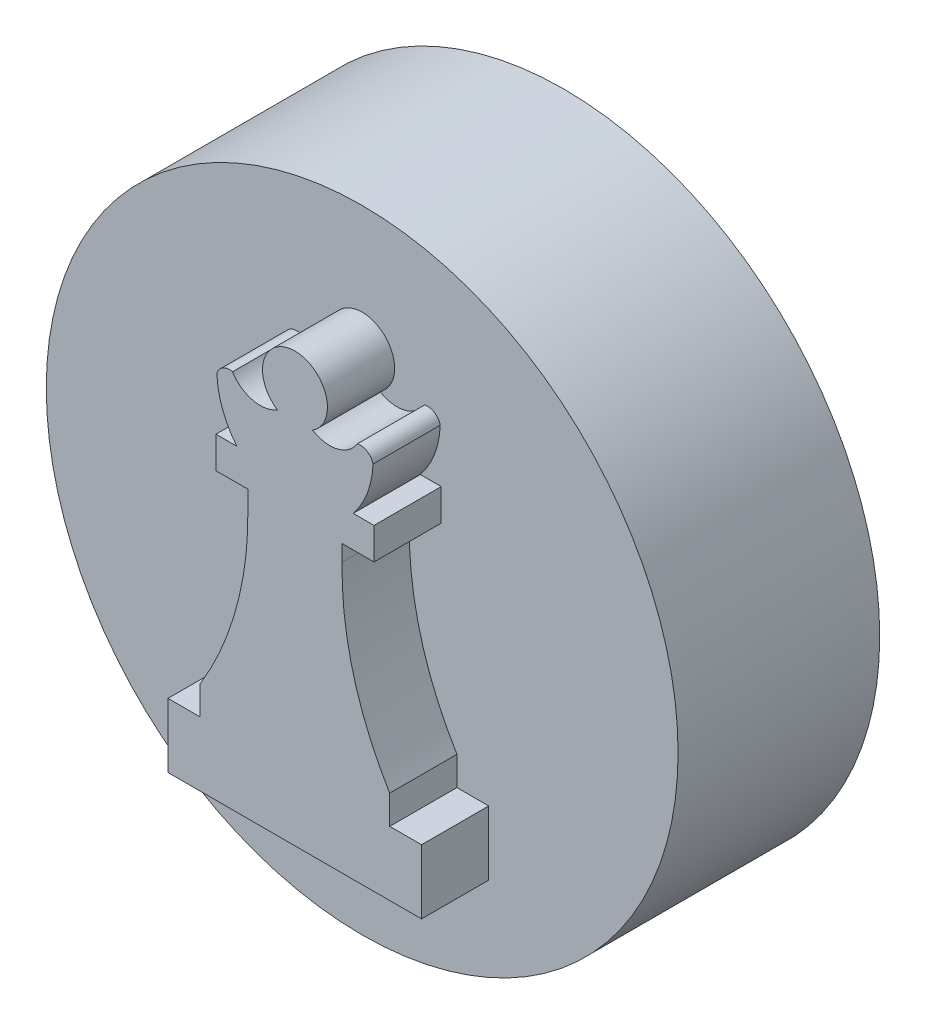
ISO-10303-21;
HEADER;
FILE_DESCRIPTION(('STEP AP214'),'2;1');
FILE_NAME('part.step','',(''),(''),'','','');
FILE_SCHEMA(('AUTOMOTIVE_DESIGN { 1 0 10303 214 1 1 1 1 }'));
ENDSEC;
DATA;
#1=APPLICATION_CONTEXT('core data for automotive mechanical design processes');
#2=APPLICATION_PROTOCOL_DEFINITION('international standard','automotive_design',2000,#1);
#3=PRODUCT_CONTEXT('',#1,'mechanical');
#4=PRODUCT('Part','Part','',(#3));
#5=PRODUCT_RELATED_PRODUCT_CATEGORY('part','',(#4));
#6=PRODUCT_DEFINITION_FORMATION('','',#4);
#7=PRODUCT_DEFINITION_CONTEXT('part definition',#1,'design');
#8=PRODUCT_DEFINITION('design','',#6,#7);
#9=PRODUCT_DEFINITION_SHAPE('','',#8);
#10=(LENGTH_UNIT() NAMED_UNIT(*) SI_UNIT(.MILLI.,.METRE.));
#11=(NAMED_UNIT(*) PLANE_ANGLE_UNIT() SI_UNIT($,.RADIAN.));
#12=(NAMED_UNIT(*) SI_UNIT($,.STERADIAN.) SOLID_ANGLE_UNIT());
#13=UNCERTAINTY_MEASURE_WITH_UNIT(LENGTH_MEASURE(1.E-05),#10,'distance_accuracy_value','');
#14=(GEOMETRIC_REPRESENTATION_CONTEXT(3) GLOBAL_UNCERTAINTY_ASSIGNED_CONTEXT((#13)) GLOBAL_UNIT_ASSIGNED_CONTEXT((#10,
#11,#12)) REPRESENTATION_CONTEXT('',''));
#15=CARTESIAN_POINT('',(0.,0.,0.));
#16=DIRECTION('',(0.,0.,1.));
#17=DIRECTION('',(1.,0.,0.));
#18=AXIS2_PLACEMENT_3D('',#15,#16,#17);
#19=CARTESIAN_POINT('',(0.,0.,0.));
#20=DIRECTION('',(0.,0.,1.));
#21=DIRECTION('',(1.,0.,0.));
#22=AXIS2_PLACEMENT_3D('',#19,#20,#21);
#23=PLANE('',#22);
#24=CARTESIAN_POINT('',(0.,0.,0.));
#25=DIRECTION('',(0.,0.,1.));
#26=DIRECTION('',(1.,0.,0.));
#27=AXIS2_PLACEMENT_3D('',#24,#25,#26);
#28=CIRCLE('',#27,11.938);
#29=CARTESIAN_POINT('',(11.938,0.,0.));
#30=VERTEX_POINT('',#29);
#31=EDGE_CURVE('E11',#30,#30,#28,.T.);
#32=ORIENTED_EDGE('',*,*,#31,.F.);
#33=EDGE_LOOP('',(#32));
#34=FACE_BOUND('',#33,.T.);
#35=CARTESIAN_POINT('',(0.,0.,0.));
#36=DIRECTION('',(0.,0.,1.));
#37=DIRECTION('',(1.,0.,0.));
#38=AXIS2_PLACEMENT_3D('',#35,#36,#37);
#39=CIRCLE('',#38,8.763);
#40=CARTESIAN_POINT('',(8.763,0.,0.));
#41=VERTEX_POINT('',#40);
#42=EDGE_CURVE('E52',#41,#41,#39,.T.);
#43=ORIENTED_EDGE('',*,*,#42,.T.);
#44=EDGE_LOOP('',(#43));
#45=FACE_BOUND('',#44,.T.);
#46=ADVANCED_FACE('F43',(#34,#45),#23,.F.);
#47=CARTESIAN_POINT('',(0.,0.,5.08));
#48=DIRECTION('',(0.,0.,-1.));
#49=DIRECTION('',(-1.,0.,0.));
#50=AXIS2_PLACEMENT_3D('',#47,#48,#49);
#51=CYLINDRICAL_SURFACE('',#50,11.938);
#52=ORIENTED_EDGE('',*,*,#31,.T.);
#53=EDGE_LOOP('',(#52));
#54=FACE_BOUND('',#53,.T.);
#55=CARTESIAN_POINT('',(0.,0.,7.62));
#56=DIRECTION('',(0.,0.,1.));
#57=DIRECTION('',(1.,0.,0.));
#58=AXIS2_PLACEMENT_3D('',#55,#56,#57);
#59=CIRCLE('',#58,11.938);
#60=CARTESIAN_POINT('',(11.938,0.,7.62));
#61=VERTEX_POINT('',#60);
#62=EDGE_CURVE('E245',#61,#61,#59,.T.);
#63=ORIENTED_EDGE('',*,*,#62,.F.);
#64=EDGE_LOOP('',(#63));
#65=FACE_BOUND('',#64,.T.);
#66=ADVANCED_FACE('F45',(#54,#65),#51,.T.);
#67=CARTESIAN_POINT('',(0.,0.,5.08));
#68=DIRECTION('',(0.,0.,-1.));
#69=DIRECTION('',(-1.,0.,0.));
#70=AXIS2_PLACEMENT_3D('',#67,#68,#69);
#71=CYLINDRICAL_SURFACE('',#70,8.763);
#72=CARTESIAN_POINT('',(0.,0.,5.08));
#73=DIRECTION('',(0.,0.,1.));
#74=DIRECTION('',(1.,0.,0.));
#75=AXIS2_PLACEMENT_3D('',#72,#73,#74);
#76=CIRCLE('',#75,8.763);
#77=CARTESIAN_POINT('',(8.763,0.,5.08));
#78=VERTEX_POINT('',#77);
#79=EDGE_CURVE('E250',#78,#78,#76,.T.);
#80=ORIENTED_EDGE('',*,*,#79,.T.);
#81=EDGE_LOOP('',(#80));
#82=FACE_BOUND('',#81,.T.);
#83=ORIENTED_EDGE('',*,*,#42,.F.);
#84=EDGE_LOOP('',(#83));
#85=FACE_BOUND('',#84,.T.);
#86=ADVANCED_FACE('F263',(#82,#85),#71,.F.);
#87=CARTESIAN_POINT('',(0.,0.,5.08));
#88=DIRECTION('',(0.,0.,1.));
#89=DIRECTION('',(1.,0.,0.));
#90=AXIS2_PLACEMENT_3D('',#87,#88,#89);
#91=PLANE('',#90);
#92=ORIENTED_EDGE('',*,*,#79,.F.);
#93=EDGE_LOOP('',(#92));
#94=FACE_BOUND('',#93,.T.);
#95=ADVANCED_FACE('F265',(#94),#91,.F.);
#96=CARTESIAN_POINT('',(0.,0.,7.62));
#97=DIRECTION('',(0.,0.,1.));
#98=DIRECTION('',(1.,0.,0.));
#99=AXIS2_PLACEMENT_3D('',#96,#97,#98);
#100=PLANE('',#99);
#101=CARTESIAN_POINT('',(14.1178732428506,2.18790034546617,7.62));
#102=DIRECTION('',(0.,0.,-1.));
#103=DIRECTION('',(-1.,0.,0.));
#104=AXIS2_PLACEMENT_3D('',#101,#102,#103);
#105=CIRCLE('',#104,12.3397850795467);
#106=CARTESIAN_POINT('',(3.5812032049433,-4.23462877643526,7.62));
#107=VERTEX_POINT('',#106);
#108=CARTESIAN_POINT('',(1.78033276673354,2.42325286739607,7.62));
#109=VERTEX_POINT('',#108);
#110=EDGE_CURVE('E61',#107,#109,#105,.T.);
#111=ORIENTED_EDGE('',*,*,#110,.F.);
#112=DIRECTION('',(0.,1.,0.));
#113=VECTOR('',#112,1.);
#114=CARTESIAN_POINT('',(3.5812032049433,-5.32306621584942,7.62));
#115=LINE('',#114,#113);
#116=CARTESIAN_POINT('',(3.5812032049433,-5.32306621584942,7.62));
#117=VERTEX_POINT('',#116);
#118=EDGE_CURVE('E65',#117,#107,#115,.T.);
#119=ORIENTED_EDGE('',*,*,#118,.F.);
#120=DIRECTION('',(1.,0.,0.));
#121=VECTOR('',#120,1.);
#122=CARTESIAN_POINT('',(3.5812032049433,-5.32306621584942,7.62));
#123=LINE('',#122,#121);
#124=CARTESIAN_POINT('',(4.78289084444419,-5.32306621584942,7.62));
#125=VERTEX_POINT('',#124);
#126=EDGE_CURVE('E569',#117,#125,#123,.T.);
#127=ORIENTED_EDGE('',*,*,#126,.T.);
#128=DIRECTION('',(0.,1.,0.));
#129=VECTOR('',#128,1.);
#130=CARTESIAN_POINT('',(4.78289084444419,-7.75058761291091,7.62));
#131=LINE('',#130,#129);
#132=CARTESIAN_POINT('',(4.78289084444419,-7.75058761291091,7.62));
#133=VERTEX_POINT('',#132);
#134=EDGE_CURVE('E732',#133,#125,#131,.T.);
#135=ORIENTED_EDGE('',*,*,#134,.F.);
#136=DIRECTION('',(1.,0.,0.));
#137=VECTOR('',#136,1.);
#138=CARTESIAN_POINT('',(-4.79891109273756,-7.75058761291091,7.62));
#139=LINE('',#138,#137);
#140=CARTESIAN_POINT('',(-4.79891109273756,-7.75058761291091,7.62));
#141=VERTEX_POINT('',#140);
#142=EDGE_CURVE('E728',#141,#133,#139,.T.);
#143=ORIENTED_EDGE('',*,*,#142,.F.);
#144=DIRECTION('',(0.,1.,0.));
#145=VECTOR('',#144,1.);
#146=CARTESIAN_POINT('',(-4.79891109273756,-7.75058761291091,7.62));
#147=LINE('',#146,#145);
#148=CARTESIAN_POINT('',(-4.79891109273756,-5.32306621584942,7.62));
#149=VERTEX_POINT('',#148);
#150=EDGE_CURVE('E725',#141,#149,#147,.T.);
#151=ORIENTED_EDGE('',*,*,#150,.T.);
#152=DIRECTION('',(1.,0.,0.));
#153=VECTOR('',#152,1.);
#154=CARTESIAN_POINT('',(-4.79891109273756,-5.32306621584942,7.62));
#155=LINE('',#154,#153);
#156=CARTESIAN_POINT('',(-3.5812032049433,-5.32306621584942,7.62));
#157=VERTEX_POINT('',#156);
#158=EDGE_CURVE('E722',#149,#157,#155,.T.);
#159=ORIENTED_EDGE('',*,*,#158,.T.);
#160=DIRECTION('',(0.,1.,0.));
#161=VECTOR('',#160,1.);
#162=CARTESIAN_POINT('',(-3.5812032049433,-5.32306621584942,7.62));
#163=LINE('',#162,#161);
#164=CARTESIAN_POINT('',(-3.58120320494331,-4.23462877643527,7.62));
#165=VERTEX_POINT('',#164);
#166=EDGE_CURVE('E719',#157,#165,#163,.T.);
#167=ORIENTED_EDGE('',*,*,#166,.T.);
#168=CARTESIAN_POINT('',(-14.1178732428506,2.18790034546617,7.62));
#169=DIRECTION('',(0.,0.,1.));
#170=DIRECTION('',(1.,0.,0.));
#171=AXIS2_PLACEMENT_3D('',#168,#169,#170);
#172=CIRCLE('',#171,12.3397850795467);
#173=CARTESIAN_POINT('',(-1.78033276673354,2.42325286739607,7.62));
#174=VERTEX_POINT('',#173);
#175=EDGE_CURVE('E716',#165,#174,#172,.T.);
#176=ORIENTED_EDGE('',*,*,#175,.T.);
#177=DIRECTION('',(0.,1.,0.));
#178=VECTOR('',#177,1.);
#179=CARTESIAN_POINT('',(-1.78033276673354,2.42325286739607,7.62));
#180=LINE('',#179,#178);
#181=CARTESIAN_POINT('',(-1.78033276673354,3.03304504856313,7.62));
#182=VERTEX_POINT('',#181);
#183=EDGE_CURVE('E713',#174,#182,#180,.T.);
#184=ORIENTED_EDGE('',*,*,#183,.T.);
#185=DIRECTION('',(1.,0.,0.));
#186=VECTOR('',#185,1.);
#187=CARTESIAN_POINT('',(-2.9866231897838,3.03304504856313,7.62));
#188=LINE('',#187,#186);
#189=CARTESIAN_POINT('',(-2.9866231897838,3.03304504856313,7.62));
#190=VERTEX_POINT('',#189);
#191=EDGE_CURVE('E709',#190,#182,#188,.T.);
#192=ORIENTED_EDGE('',*,*,#191,.F.);
#193=DIRECTION('',(0.,-1.,0.));
#194=VECTOR('',#193,1.);
#195=CARTESIAN_POINT('',(-2.9866231897838,4.22988557605376,7.62));
#196=LINE('',#195,#194);
#197=CARTESIAN_POINT('',(-2.9866231897838,4.22988557605376,7.62));
#198=VERTEX_POINT('',#197);
#199=EDGE_CURVE('E705',#198,#190,#196,.T.);
#200=ORIENTED_EDGE('',*,*,#199,.F.);
#201=DIRECTION('',(-1.,0.,0.));
#202=VECTOR('',#201,1.);
#203=CARTESIAN_POINT('',(-2.20008918199819,4.22988557605376,7.62));
#204=LINE('',#203,#202);
#205=CARTESIAN_POINT('',(-2.20008918199819,4.22988557605376,7.62));
#206=VERTEX_POINT('',#205);
#207=EDGE_CURVE('E701',#206,#198,#204,.T.);
#208=ORIENTED_EDGE('',*,*,#207,.F.);
#209=CARTESIAN_POINT('',(0.415223482436921,6.35186901560625,7.62));
#210=DIRECTION('',(0.,0.,-1.));
#211=DIRECTION('',(-1.,0.,0.));
#212=AXIS2_PLACEMENT_3D('',#209,#210,#211);
#213=CIRCLE('',#212,3.36788866361252);
#214=CARTESIAN_POINT('',(-2.95009700568467,6.22036972770418,7.62));
#215=VERTEX_POINT('',#214);
#216=EDGE_CURVE('E698',#206,#215,#213,.T.);
#217=ORIENTED_EDGE('',*,*,#216,.T.);
#218=CARTESIAN_POINT('',(-2.47138184616778,6.10745679508121,7.62));
#219=DIRECTION('',(0.,0.,1.));
#220=DIRECTION('',(1.,0.,0.));
#221=AXIS2_PLACEMENT_3D('',#218,#219,#220);
#222=CIRCLE('',#221,0.491851130226217);
#223=CARTESIAN_POINT('',(-2.35846891354481,6.5861719545981,7.62));
#224=VERTEX_POINT('',#223);
#225=EDGE_CURVE('E694',#224,#215,#222,.T.);
#226=ORIENTED_EDGE('',*,*,#225,.F.);
#227=CARTESIAN_POINT('',(-1.31363776866638,7.23218853934523,7.62));
#228=DIRECTION('',(0.,0.,-1.));
#229=DIRECTION('',(-1.,0.,0.));
#230=AXIS2_PLACEMENT_3D('',#227,#228,#229);
#231=CIRCLE('',#230,1.22841749787127);
#232=CARTESIAN_POINT('',(-0.667621183919253,6.18735739446679,7.62));
#233=VERTEX_POINT('',#232);
#234=EDGE_CURVE('E690',#233,#224,#231,.T.);
#235=ORIENTED_EDGE('',*,*,#234,.F.);
#236=CARTESIAN_POINT('',(0.,7.21690647742095,7.62));
#237=DIRECTION('',(0.,0.,1.));
#238=DIRECTION('',(1.,0.,0.));
#239=AXIS2_PLACEMENT_3D('',#236,#237,#238);
#240=CIRCLE('',#239,1.22706534440081);
#241=CARTESIAN_POINT('',(0.667621183919252,6.18735739446679,7.62));
#242=VERTEX_POINT('',#241);
#243=EDGE_CURVE('E686',#242,#233,#240,.T.);
#244=ORIENTED_EDGE('',*,*,#243,.F.);
#245=CARTESIAN_POINT('',(1.31363776866638,7.23218853934523,7.62));
#246=DIRECTION('',(0.,0.,1.));
#247=DIRECTION('',(1.,0.,0.));
#248=AXIS2_PLACEMENT_3D('',#245,#246,#247);
#249=CIRCLE('',#248,1.22841749787127);
#250=CARTESIAN_POINT('',(2.35846891354481,6.5861719545981,7.62));
#251=VERTEX_POINT('',#250);
#252=EDGE_CURVE('E683',#242,#251,#249,.T.);
#253=ORIENTED_EDGE('',*,*,#252,.T.);
#254=CARTESIAN_POINT('',(2.47138184616778,6.10745679508121,7.62));
#255=DIRECTION('',(0.,0.,-1.));
#256=DIRECTION('',(-1.,0.,0.));
#257=AXIS2_PLACEMENT_3D('',#254,#255,#256);
#258=CIRCLE('',#257,0.491851130226217);
#259=CARTESIAN_POINT('',(2.95009700568467,6.22036972770418,7.62));
#260=VERTEX_POINT('',#259);
#261=EDGE_CURVE('E680',#251,#260,#258,.T.);
#262=ORIENTED_EDGE('',*,*,#261,.T.);
#263=CARTESIAN_POINT('',(-0.415223482436921,6.35186901560625,7.62));
#264=DIRECTION('',(0.,0.,1.));
#265=DIRECTION('',(1.,0.,0.));
#266=AXIS2_PLACEMENT_3D('',#263,#264,#265);
#267=CIRCLE('',#266,3.36788866361252);
#268=CARTESIAN_POINT('',(2.20008918199819,4.22988557605376,7.62));
#269=VERTEX_POINT('',#268);
#270=EDGE_CURVE('E676',#269,#260,#267,.T.);
#271=ORIENTED_EDGE('',*,*,#270,.F.);
#272=DIRECTION('',(1.,0.,0.));
#273=VECTOR('',#272,1.);
#274=CARTESIAN_POINT('',(2.20008918199819,4.22988557605376,7.62));
#275=LINE('',#274,#273);
#276=CARTESIAN_POINT('',(2.9866231897838,4.22988557605376,7.62));
#277=VERTEX_POINT('',#276);
#278=EDGE_CURVE('E669',#269,#277,#275,.T.);
#279=ORIENTED_EDGE('',*,*,#278,.T.);
#280=DIRECTION('',(0.,-1.,0.));
#281=VECTOR('',#280,1.);
#282=CARTESIAN_POINT('',(2.9866231897838,4.22988557605376,7.62));
#283=LINE('',#282,#281);
#284=CARTESIAN_POINT('',(2.9866231897838,3.03304504856313,7.62));
#285=VERTEX_POINT('',#284);
#286=EDGE_CURVE('E660',#277,#285,#283,.T.);
#287=ORIENTED_EDGE('',*,*,#286,.T.);
#288=DIRECTION('',(-1.,0.,0.));
#289=VECTOR('',#288,1.);
#290=CARTESIAN_POINT('',(2.9866231897838,3.03304504856313,7.62));
#291=LINE('',#290,#289);
#292=CARTESIAN_POINT('',(1.78033276673354,3.03304504856313,7.62));
#293=VERTEX_POINT('',#292);
#294=EDGE_CURVE('E663',#285,#293,#291,.T.);
#295=ORIENTED_EDGE('',*,*,#294,.T.);
#296=DIRECTION('',(0.,1.,0.));
#297=VECTOR('',#296,1.);
#298=CARTESIAN_POINT('',(1.78033276673354,2.42325286739607,7.62));
#299=LINE('',#298,#297);
#300=EDGE_CURVE('E665',#109,#293,#299,.T.);
#301=ORIENTED_EDGE('',*,*,#300,.F.);
#302=EDGE_LOOP('',(#111,#119,#127,#135,#143,#151,#159,#167,#176,#184,#192,#200,#208,#217,#226,
#235,#244,#253,#262,#271,#279,#287,#295,#301));
#303=FACE_BOUND('',#302,.T.);
#304=ORIENTED_EDGE('',*,*,#62,.T.);
#305=EDGE_LOOP('',(#304));
#306=FACE_BOUND('',#305,.T.);
#307=ADVANCED_FACE('F272',(#303,#306),#100,.T.);
#308=CARTESIAN_POINT('',(14.1178732428506,2.18790034546617,10.16));
#309=DIRECTION('',(0.,0.,-1.));
#310=DIRECTION('',(-1.,0.,0.));
#311=AXIS2_PLACEMENT_3D('',#308,#309,#310);
#312=CYLINDRICAL_SURFACE('',#311,12.3397850795467);
#313=ORIENTED_EDGE('',*,*,#110,.T.);
#314=DIRECTION('',(0.,0.,-1.));
#315=VECTOR('',#314,1.);
#316=CARTESIAN_POINT('',(1.78033276673354,2.42325286739607,10.16));
#317=LINE('',#316,#315);
#318=CARTESIAN_POINT('',(1.78033276673354,2.42325286739607,10.16));
#319=VERTEX_POINT('',#318);
#320=EDGE_CURVE('E223',#319,#109,#317,.T.);
#321=ORIENTED_EDGE('',*,*,#320,.F.);
#322=CARTESIAN_POINT('',(14.1178732428506,2.18790034546617,10.16));
#323=DIRECTION('',(0.,0.,-1.));
#324=DIRECTION('',(-1.,0.,0.));
#325=AXIS2_PLACEMENT_3D('',#322,#323,#324);
#326=CIRCLE('',#325,12.3397850795467);
#327=CARTESIAN_POINT('',(3.5812032049433,-4.23462877643526,10.16));
#328=VERTEX_POINT('',#327);
#329=EDGE_CURVE('E231',#328,#319,#326,.T.);
#330=ORIENTED_EDGE('',*,*,#329,.F.);
#331=DIRECTION('',(0.,0.,-1.));
#332=VECTOR('',#331,1.);
#333=CARTESIAN_POINT('',(3.5812032049433,-4.23462877643526,10.16));
#334=LINE('',#333,#332);
#335=EDGE_CURVE('E565',#328,#107,#334,.T.);
#336=ORIENTED_EDGE('',*,*,#335,.T.);
#337=EDGE_LOOP('',(#313,#321,#330,#336));
#338=FACE_BOUND('',#337,.T.);
#339=ADVANCED_FACE('F243',(#338),#312,.F.);
#340=CARTESIAN_POINT('',(1.78033276673354,2.42325286739607,10.16));
#341=DIRECTION('',(-1.,0.,0.));
#342=DIRECTION('',(0.,0.,1.));
#343=AXIS2_PLACEMENT_3D('',#340,#341,#342);
#344=PLANE('',#343);
#345=ORIENTED_EDGE('',*,*,#300,.T.);
#346=DIRECTION('',(0.,0.,-1.));
#347=VECTOR('',#346,1.);
#348=CARTESIAN_POINT('',(1.78033276673354,3.03304504856313,10.16));
#349=LINE('',#348,#347);
#350=CARTESIAN_POINT('',(1.78033276673354,3.03304504856313,10.16));
#351=VERTEX_POINT('',#350);
#352=EDGE_CURVE('E225',#351,#293,#349,.T.);
#353=ORIENTED_EDGE('',*,*,#352,.F.);
#354=DIRECTION('',(0.,1.,0.));
#355=VECTOR('',#354,1.);
#356=CARTESIAN_POINT('',(1.78033276673354,2.42325286739607,10.16));
#357=LINE('',#356,#355);
#358=EDGE_CURVE('E218',#319,#351,#357,.T.);
#359=ORIENTED_EDGE('',*,*,#358,.F.);
#360=ORIENTED_EDGE('',*,*,#320,.T.);
#361=EDGE_LOOP('',(#345,#353,#359,#360));
#362=FACE_BOUND('',#361,.T.);
#363=ADVANCED_FACE('F221',(#362),#344,.F.);
#364=CARTESIAN_POINT('',(2.9866231897838,3.03304504856313,10.16));
#365=DIRECTION('',(0.,-1.,0.));
#366=DIRECTION('',(0.,0.,-1.));
#367=AXIS2_PLACEMENT_3D('',#364,#365,#366);
#368=PLANE('',#367);
#369=ORIENTED_EDGE('',*,*,#294,.F.);
#370=DIRECTION('',(0.,0.,-1.));
#371=VECTOR('',#370,1.);
#372=CARTESIAN_POINT('',(2.9866231897838,3.03304504856313,10.16));
#373=LINE('',#372,#371);
#374=CARTESIAN_POINT('',(2.9866231897838,3.03304504856313,10.16));
#375=VERTEX_POINT('',#374);
#376=EDGE_CURVE('E252',#375,#285,#373,.T.);
#377=ORIENTED_EDGE('',*,*,#376,.F.);
#378=DIRECTION('',(-1.,0.,0.));
#379=VECTOR('',#378,1.);
#380=CARTESIAN_POINT('',(2.9866231897838,3.03304504856313,10.16));
#381=LINE('',#380,#379);
#382=EDGE_CURVE('E230',#375,#351,#381,.T.);
#383=ORIENTED_EDGE('',*,*,#382,.T.);
#384=ORIENTED_EDGE('',*,*,#352,.T.);
#385=EDGE_LOOP('',(#369,#377,#383,#384));
#386=FACE_BOUND('',#385,.T.);
#387=ADVANCED_FACE('F293',(#386),#368,.T.);
#388=CARTESIAN_POINT('',(2.9866231897838,4.22988557605376,10.16));
#389=DIRECTION('',(1.,0.,0.));
#390=DIRECTION('',(0.,0.,-1.));
#391=AXIS2_PLACEMENT_3D('',#388,#389,#390);
#392=PLANE('',#391);
#393=ORIENTED_EDGE('',*,*,#286,.F.);
#394=DIRECTION('',(0.,0.,-1.));
#395=VECTOR('',#394,1.);
#396=CARTESIAN_POINT('',(2.9866231897838,4.22988557605376,10.16));
#397=LINE('',#396,#395);
#398=CARTESIAN_POINT('',(2.9866231897838,4.22988557605376,10.16));
#399=VERTEX_POINT('',#398);
#400=EDGE_CURVE('E652',#399,#277,#397,.T.);
#401=ORIENTED_EDGE('',*,*,#400,.F.);
#402=DIRECTION('',(0.,-1.,0.));
#403=VECTOR('',#402,1.);
#404=CARTESIAN_POINT('',(2.9866231897838,4.22988557605376,10.16));
#405=LINE('',#404,#403);
#406=EDGE_CURVE('E662',#399,#375,#405,.T.);
#407=ORIENTED_EDGE('',*,*,#406,.T.);
#408=ORIENTED_EDGE('',*,*,#376,.T.);
#409=EDGE_LOOP('',(#393,#401,#407,#408));
#410=FACE_BOUND('',#409,.T.);
#411=ADVANCED_FACE('F296',(#410),#392,.T.);
#412=CARTESIAN_POINT('',(2.20008918199819,4.22988557605376,10.16));
#413=DIRECTION('',(0.,1.,0.));
#414=DIRECTION('',(0.,0.,1.));
#415=AXIS2_PLACEMENT_3D('',#412,#413,#414);
#416=PLANE('',#415);
#417=ORIENTED_EDGE('',*,*,#278,.F.);
#418=DIRECTION('',(0.,0.,-1.));
#419=VECTOR('',#418,1.);
#420=CARTESIAN_POINT('',(2.20008918199819,4.22988557605376,10.16));
#421=LINE('',#420,#419);
#422=CARTESIAN_POINT('',(2.20008918199819,4.22988557605376,10.16));
#423=VERTEX_POINT('',#422);
#424=EDGE_CURVE('E648',#423,#269,#421,.T.);
#425=ORIENTED_EDGE('',*,*,#424,.F.);
#426=DIRECTION('',(1.,0.,0.));
#427=VECTOR('',#426,1.);
#428=CARTESIAN_POINT('',(2.20008918199819,4.22988557605376,10.16));
#429=LINE('',#428,#427);
#430=EDGE_CURVE('E796',#423,#399,#429,.T.);
#431=ORIENTED_EDGE('',*,*,#430,.T.);
#432=ORIENTED_EDGE('',*,*,#400,.T.);
#433=EDGE_LOOP('',(#417,#425,#431,#432));
#434=FACE_BOUND('',#433,.T.);
#435=ADVANCED_FACE('F300',(#434),#416,.T.);
#436=CARTESIAN_POINT('',(-0.415223482436921,6.35186901560625,10.16));
#437=DIRECTION('',(0.,0.,-1.));
#438=DIRECTION('',(-1.,0.,0.));
#439=AXIS2_PLACEMENT_3D('',#436,#437,#438);
#440=CYLINDRICAL_SURFACE('',#439,3.36788866361252);
#441=ORIENTED_EDGE('',*,*,#270,.T.);
#442=DIRECTION('',(0.,0.,-1.));
#443=VECTOR('',#442,1.);
#444=CARTESIAN_POINT('',(2.95009700568467,6.22036972770418,10.16));
#445=LINE('',#444,#443);
#446=CARTESIAN_POINT('',(2.95009700568467,6.22036972770418,10.16));
#447=VERTEX_POINT('',#446);
#448=EDGE_CURVE('E644',#447,#260,#445,.T.);
#449=ORIENTED_EDGE('',*,*,#448,.F.);
#450=CARTESIAN_POINT('',(-0.415223482436921,6.35186901560625,10.16));
#451=DIRECTION('',(0.,0.,1.));
#452=DIRECTION('',(1.,0.,0.));
#453=AXIS2_PLACEMENT_3D('',#450,#451,#452);
#454=CIRCLE('',#453,3.36788866361252);
#455=EDGE_CURVE('E793',#423,#447,#454,.T.);
#456=ORIENTED_EDGE('',*,*,#455,.F.);
#457=ORIENTED_EDGE('',*,*,#424,.T.);
#458=EDGE_LOOP('',(#441,#449,#456,#457));
#459=FACE_BOUND('',#458,.T.);
#460=ADVANCED_FACE('F304',(#459),#440,.T.);
#461=CARTESIAN_POINT('',(2.47138184616778,6.10745679508121,10.16));
#462=DIRECTION('',(0.,0.,-1.));
#463=DIRECTION('',(-1.,0.,0.));
#464=AXIS2_PLACEMENT_3D('',#461,#462,#463);
#465=CYLINDRICAL_SURFACE('',#464,0.491851130226217);
#466=ORIENTED_EDGE('',*,*,#261,.F.);
#467=DIRECTION('',(0.,0.,-1.));
#468=VECTOR('',#467,1.);
#469=CARTESIAN_POINT('',(2.35846891354481,6.5861719545981,10.16));
#470=LINE('',#469,#468);
#471=CARTESIAN_POINT('',(2.35846891354481,6.5861719545981,10.16));
#472=VERTEX_POINT('',#471);
#473=EDGE_CURVE('E640',#472,#251,#470,.T.);
#474=ORIENTED_EDGE('',*,*,#473,.F.);
#475=CARTESIAN_POINT('',(2.47138184616778,6.10745679508121,10.16));
#476=DIRECTION('',(0.,0.,-1.));
#477=DIRECTION('',(-1.,0.,0.));
#478=AXIS2_PLACEMENT_3D('',#475,#476,#477);
#479=CIRCLE('',#478,0.491851130226217);
#480=EDGE_CURVE('E790',#472,#447,#479,.T.);
#481=ORIENTED_EDGE('',*,*,#480,.T.);
#482=ORIENTED_EDGE('',*,*,#448,.T.);
#483=EDGE_LOOP('',(#466,#474,#481,#482));
#484=FACE_BOUND('',#483,.T.);
#485=ADVANCED_FACE('F308',(#484),#465,.T.);
#486=CARTESIAN_POINT('',(1.31363776866638,7.23218853934523,10.16));
#487=DIRECTION('',(0.,0.,-1.));
#488=DIRECTION('',(-1.,0.,0.));
#489=AXIS2_PLACEMENT_3D('',#486,#487,#488);
#490=CYLINDRICAL_SURFACE('',#489,1.22841749787127);
#491=ORIENTED_EDGE('',*,*,#252,.F.);
#492=DIRECTION('',(0.,0.,-1.));
#493=VECTOR('',#492,1.);
#494=CARTESIAN_POINT('',(0.667621183919252,6.18735739446679,10.16));
#495=LINE('',#494,#493);
#496=CARTESIAN_POINT('',(0.667621183919252,6.18735739446679,10.16));
#497=VERTEX_POINT('',#496);
#498=EDGE_CURVE('E636',#497,#242,#495,.T.);
#499=ORIENTED_EDGE('',*,*,#498,.F.);
#500=CARTESIAN_POINT('',(1.31363776866638,7.23218853934523,10.16));
#501=DIRECTION('',(0.,0.,1.));
#502=DIRECTION('',(1.,0.,0.));
#503=AXIS2_PLACEMENT_3D('',#500,#501,#502);
#504=CIRCLE('',#503,1.22841749787127);
#505=EDGE_CURVE('E808',#497,#472,#504,.T.);
#506=ORIENTED_EDGE('',*,*,#505,.T.);
#507=ORIENTED_EDGE('',*,*,#473,.T.);
#508=EDGE_LOOP('',(#491,#499,#506,#507));
#509=FACE_BOUND('',#508,.T.);
#510=ADVANCED_FACE('F312',(#509),#490,.F.);
#511=CARTESIAN_POINT('',(0.,7.21690647742095,10.16));
#512=DIRECTION('',(0.,0.,-1.));
#513=DIRECTION('',(-1.,0.,0.));
#514=AXIS2_PLACEMENT_3D('',#511,#512,#513);
#515=CYLINDRICAL_SURFACE('',#514,1.22706534440081);
#516=ORIENTED_EDGE('',*,*,#243,.T.);
#517=DIRECTION('',(0.,0.,-1.));
#518=VECTOR('',#517,1.);
#519=CARTESIAN_POINT('',(-0.667621183919253,6.18735739446679,10.16));
#520=LINE('',#519,#518);
#521=CARTESIAN_POINT('',(-0.667621183919253,6.18735739446679,10.16));
#522=VERTEX_POINT('',#521);
#523=EDGE_CURVE('E632',#522,#233,#520,.T.);
#524=ORIENTED_EDGE('',*,*,#523,.F.);
#525=CARTESIAN_POINT('',(0.,7.21690647742095,10.16));
#526=DIRECTION('',(0.,0.,1.));
#527=DIRECTION('',(1.,0.,0.));
#528=AXIS2_PLACEMENT_3D('',#525,#526,#527);
#529=CIRCLE('',#528,1.22706534440081);
#530=EDGE_CURVE('E783',#497,#522,#529,.T.);
#531=ORIENTED_EDGE('',*,*,#530,.F.);
#532=ORIENTED_EDGE('',*,*,#498,.T.);
#533=EDGE_LOOP('',(#516,#524,#531,#532));
#534=FACE_BOUND('',#533,.T.);
#535=ADVANCED_FACE('F316',(#534),#515,.T.);
#536=CARTESIAN_POINT('',(-1.31363776866638,7.23218853934523,10.16));
#537=DIRECTION('',(0.,0.,-1.));
#538=DIRECTION('',(-1.,0.,0.));
#539=AXIS2_PLACEMENT_3D('',#536,#537,#538);
#540=CYLINDRICAL_SURFACE('',#539,1.22841749787127);
#541=ORIENTED_EDGE('',*,*,#234,.T.);
#542=DIRECTION('',(0.,0.,-1.));
#543=VECTOR('',#542,1.);
#544=CARTESIAN_POINT('',(-2.35846891354481,6.5861719545981,10.16));
#545=LINE('',#544,#543);
#546=CARTESIAN_POINT('',(-2.35846891354481,6.5861719545981,10.16));
#547=VERTEX_POINT('',#546);
#548=EDGE_CURVE('E628',#547,#224,#545,.T.);
#549=ORIENTED_EDGE('',*,*,#548,.F.);
#550=CARTESIAN_POINT('',(-1.31363776866638,7.23218853934523,10.16));
#551=DIRECTION('',(0.,0.,-1.));
#552=DIRECTION('',(-1.,0.,0.));
#553=AXIS2_PLACEMENT_3D('',#550,#551,#552);
#554=CIRCLE('',#553,1.22841749787127);
#555=EDGE_CURVE('E779',#522,#547,#554,.T.);
#556=ORIENTED_EDGE('',*,*,#555,.F.);
#557=ORIENTED_EDGE('',*,*,#523,.T.);
#558=EDGE_LOOP('',(#541,#549,#556,#557));
#559=FACE_BOUND('',#558,.T.);
#560=ADVANCED_FACE('F320',(#559),#540,.F.);
#561=CARTESIAN_POINT('',(-2.47138184616778,6.10745679508121,10.16));
#562=DIRECTION('',(0.,0.,-1.));
#563=DIRECTION('',(-1.,0.,0.));
#564=AXIS2_PLACEMENT_3D('',#561,#562,#563);
#565=CYLINDRICAL_SURFACE('',#564,0.491851130226217);
#566=ORIENTED_EDGE('',*,*,#225,.T.);
#567=DIRECTION('',(0.,0.,-1.));
#568=VECTOR('',#567,1.);
#569=CARTESIAN_POINT('',(-2.95009700568467,6.22036972770418,10.16));
#570=LINE('',#569,#568);
#571=CARTESIAN_POINT('',(-2.95009700568467,6.22036972770418,10.16));
#572=VERTEX_POINT('',#571);
#573=EDGE_CURVE('E624',#572,#215,#570,.T.);
#574=ORIENTED_EDGE('',*,*,#573,.F.);
#575=CARTESIAN_POINT('',(-2.47138184616778,6.10745679508121,10.16));
#576=DIRECTION('',(0.,0.,1.));
#577=DIRECTION('',(1.,0.,0.));
#578=AXIS2_PLACEMENT_3D('',#575,#576,#577);
#579=CIRCLE('',#578,0.491851130226217);
#580=EDGE_CURVE('E777',#547,#572,#579,.T.);
#581=ORIENTED_EDGE('',*,*,#580,.F.);
#582=ORIENTED_EDGE('',*,*,#548,.T.);
#583=EDGE_LOOP('',(#566,#574,#581,#582));
#584=FACE_BOUND('',#583,.T.);
#585=ADVANCED_FACE('F324',(#584),#565,.T.);
#586=CARTESIAN_POINT('',(0.415223482436921,6.35186901560625,10.16));
#587=DIRECTION('',(0.,0.,-1.));
#588=DIRECTION('',(-1.,0.,0.));
#589=AXIS2_PLACEMENT_3D('',#586,#587,#588);
#590=CYLINDRICAL_SURFACE('',#589,3.36788866361252);
#591=ORIENTED_EDGE('',*,*,#216,.F.);
#592=DIRECTION('',(0.,0.,-1.));
#593=VECTOR('',#592,1.);
#594=CARTESIAN_POINT('',(-2.20008918199819,4.22988557605376,10.16));
#595=LINE('',#594,#593);
#596=CARTESIAN_POINT('',(-2.20008918199819,4.22988557605376,10.16));
#597=VERTEX_POINT('',#596);
#598=EDGE_CURVE('E620',#597,#206,#595,.T.);
#599=ORIENTED_EDGE('',*,*,#598,.F.);
#600=CARTESIAN_POINT('',(0.415223482436921,6.35186901560625,10.16));
#601=DIRECTION('',(0.,0.,-1.));
#602=DIRECTION('',(-1.,0.,0.));
#603=AXIS2_PLACEMENT_3D('',#600,#601,#602);
#604=CIRCLE('',#603,3.36788866361252);
#605=EDGE_CURVE('E774',#597,#572,#604,.T.);
#606=ORIENTED_EDGE('',*,*,#605,.T.);
#607=ORIENTED_EDGE('',*,*,#573,.T.);
#608=EDGE_LOOP('',(#591,#599,#606,#607));
#609=FACE_BOUND('',#608,.T.);
#610=ADVANCED_FACE('F328',(#609),#590,.T.);
#611=CARTESIAN_POINT('',(-2.20008918199819,4.22988557605376,10.16));
#612=DIRECTION('',(0.,-1.,0.));
#613=DIRECTION('',(0.,0.,-1.));
#614=AXIS2_PLACEMENT_3D('',#611,#612,#613);
#615=PLANE('',#614);
#616=ORIENTED_EDGE('',*,*,#207,.T.);
#617=DIRECTION('',(0.,0.,-1.));
#618=VECTOR('',#617,1.);
#619=CARTESIAN_POINT('',(-2.9866231897838,4.22988557605376,10.16));
#620=LINE('',#619,#618);
#621=CARTESIAN_POINT('',(-2.9866231897838,4.22988557605376,10.16));
#622=VERTEX_POINT('',#621);
#623=EDGE_CURVE('E616',#622,#198,#620,.T.);
#624=ORIENTED_EDGE('',*,*,#623,.F.);
#625=DIRECTION('',(-1.,0.,0.));
#626=VECTOR('',#625,1.);
#627=CARTESIAN_POINT('',(-2.20008918199819,4.22988557605376,10.16));
#628=LINE('',#627,#626);
#629=EDGE_CURVE('E769',#597,#622,#628,.T.);
#630=ORIENTED_EDGE('',*,*,#629,.F.);
#631=ORIENTED_EDGE('',*,*,#598,.T.);
#632=EDGE_LOOP('',(#616,#624,#630,#631));
#633=FACE_BOUND('',#632,.T.);
#634=ADVANCED_FACE('F332',(#633),#615,.F.);
#635=CARTESIAN_POINT('',(-2.9866231897838,4.22988557605376,10.16));
#636=DIRECTION('',(1.,0.,0.));
#637=DIRECTION('',(0.,0.,-1.));
#638=AXIS2_PLACEMENT_3D('',#635,#636,#637);
#639=PLANE('',#638);
#640=ORIENTED_EDGE('',*,*,#199,.T.);
#641=DIRECTION('',(0.,0.,-1.));
#642=VECTOR('',#641,1.);
#643=CARTESIAN_POINT('',(-2.9866231897838,3.03304504856313,10.16));
#644=LINE('',#643,#642);
#645=CARTESIAN_POINT('',(-2.9866231897838,3.03304504856313,10.16));
#646=VERTEX_POINT('',#645);
#647=EDGE_CURVE('E612',#646,#190,#644,.T.);
#648=ORIENTED_EDGE('',*,*,#647,.F.);
#649=DIRECTION('',(0.,-1.,0.));
#650=VECTOR('',#649,1.);
#651=CARTESIAN_POINT('',(-2.9866231897838,4.22988557605376,10.16));
#652=LINE('',#651,#650);
#653=EDGE_CURVE('E767',#622,#646,#652,.T.);
#654=ORIENTED_EDGE('',*,*,#653,.F.);
#655=ORIENTED_EDGE('',*,*,#623,.T.);
#656=EDGE_LOOP('',(#640,#648,#654,#655));
#657=FACE_BOUND('',#656,.T.);
#658=ADVANCED_FACE('F336',(#657),#639,.F.);
#659=CARTESIAN_POINT('',(-2.9866231897838,3.03304504856313,10.16));
#660=DIRECTION('',(0.,1.,0.));
#661=DIRECTION('',(0.,0.,1.));
#662=AXIS2_PLACEMENT_3D('',#659,#660,#661);
#663=PLANE('',#662);
#664=ORIENTED_EDGE('',*,*,#191,.T.);
#665=DIRECTION('',(0.,0.,-1.));
#666=VECTOR('',#665,1.);
#667=CARTESIAN_POINT('',(-1.78033276673354,3.03304504856313,10.16));
#668=LINE('',#667,#666);
#669=CARTESIAN_POINT('',(-1.78033276673354,3.03304504856313,10.16));
#670=VERTEX_POINT('',#669);
#671=EDGE_CURVE('E608',#670,#182,#668,.T.);
#672=ORIENTED_EDGE('',*,*,#671,.F.);
#673=DIRECTION('',(1.,0.,0.));
#674=VECTOR('',#673,1.);
#675=CARTESIAN_POINT('',(-2.9866231897838,3.03304504856313,10.16));
#676=LINE('',#675,#674);
#677=EDGE_CURVE('E823',#646,#670,#676,.T.);
#678=ORIENTED_EDGE('',*,*,#677,.F.);
#679=ORIENTED_EDGE('',*,*,#647,.T.);
#680=EDGE_LOOP('',(#664,#672,#678,#679));
#681=FACE_BOUND('',#680,.T.);
#682=ADVANCED_FACE('F340',(#681),#663,.F.);
#683=CARTESIAN_POINT('',(-1.78033276673354,2.42325286739607,10.16));
#684=DIRECTION('',(-1.,0.,0.));
#685=DIRECTION('',(0.,0.,1.));
#686=AXIS2_PLACEMENT_3D('',#683,#684,#685);
#687=PLANE('',#686);
#688=ORIENTED_EDGE('',*,*,#183,.F.);
#689=DIRECTION('',(0.,0.,-1.));
#690=VECTOR('',#689,1.);
#691=CARTESIAN_POINT('',(-1.78033276673354,2.42325286739607,10.16));
#692=LINE('',#691,#690);
#693=CARTESIAN_POINT('',(-1.78033276673354,2.42325286739607,10.16));
#694=VERTEX_POINT('',#693);
#695=EDGE_CURVE('E604',#694,#174,#692,.T.);
#696=ORIENTED_EDGE('',*,*,#695,.F.);
#697=DIRECTION('',(0.,1.,0.));
#698=VECTOR('',#697,1.);
#699=CARTESIAN_POINT('',(-1.78033276673354,2.42325286739607,10.16));
#700=LINE('',#699,#698);
#701=EDGE_CURVE('E762',#694,#670,#700,.T.);
#702=ORIENTED_EDGE('',*,*,#701,.T.);
#703=ORIENTED_EDGE('',*,*,#671,.T.);
#704=EDGE_LOOP('',(#688,#696,#702,#703));
#705=FACE_BOUND('',#704,.T.);
#706=ADVANCED_FACE('F344',(#705),#687,.T.);
#707=CARTESIAN_POINT('',(-14.1178732428506,2.18790034546617,10.16));
#708=DIRECTION('',(0.,0.,-1.));
#709=DIRECTION('',(-1.,0.,0.));
#710=AXIS2_PLACEMENT_3D('',#707,#708,#709);
#711=CYLINDRICAL_SURFACE('',#710,12.3397850795467);
#712=ORIENTED_EDGE('',*,*,#175,.F.);
#713=DIRECTION('',(0.,0.,-1.));
#714=VECTOR('',#713,1.);
#715=CARTESIAN_POINT('',(-3.58120320494331,-4.23462877643527,10.16));
#716=LINE('',#715,#714);
#717=CARTESIAN_POINT('',(-3.58120320494331,-4.23462877643527,10.16));
#718=VERTEX_POINT('',#717);
#719=EDGE_CURVE('E600',#718,#165,#716,.T.);
#720=ORIENTED_EDGE('',*,*,#719,.F.);
#721=CARTESIAN_POINT('',(-14.1178732428506,2.18790034546617,10.16));
#722=DIRECTION('',(0.,0.,1.));
#723=DIRECTION('',(1.,0.,0.));
#724=AXIS2_PLACEMENT_3D('',#721,#722,#723);
#725=CIRCLE('',#724,12.3397850795467);
#726=EDGE_CURVE('E758',#718,#694,#725,.T.);
#727=ORIENTED_EDGE('',*,*,#726,.T.);
#728=ORIENTED_EDGE('',*,*,#695,.T.);
#729=EDGE_LOOP('',(#712,#720,#727,#728));
#730=FACE_BOUND('',#729,.T.);
#731=ADVANCED_FACE('F348',(#730),#711,.F.);
#732=CARTESIAN_POINT('',(-3.5812032049433,-5.32306621584942,10.16));
#733=DIRECTION('',(-1.,0.,0.));
#734=DIRECTION('',(0.,0.,1.));
#735=AXIS2_PLACEMENT_3D('',#732,#733,#734);
#736=PLANE('',#735);
#737=ORIENTED_EDGE('',*,*,#166,.F.);
#738=DIRECTION('',(0.,0.,-1.));
#739=VECTOR('',#738,1.);
#740=CARTESIAN_POINT('',(-3.5812032049433,-5.32306621584942,10.16));
#741=LINE('',#740,#739);
#742=CARTESIAN_POINT('',(-3.5812032049433,-5.32306621584942,10.16));
#743=VERTEX_POINT('',#742);
#744=EDGE_CURVE('E596',#743,#157,#741,.T.);
#745=ORIENTED_EDGE('',*,*,#744,.F.);
#746=DIRECTION('',(0.,1.,0.));
#747=VECTOR('',#746,1.);
#748=CARTESIAN_POINT('',(-3.5812032049433,-5.32306621584942,10.16));
#749=LINE('',#748,#747);
#750=EDGE_CURVE('E830',#743,#718,#749,.T.);
#751=ORIENTED_EDGE('',*,*,#750,.T.);
#752=ORIENTED_EDGE('',*,*,#719,.T.);
#753=EDGE_LOOP('',(#737,#745,#751,#752));
#754=FACE_BOUND('',#753,.T.);
#755=ADVANCED_FACE('F352',(#754),#736,.T.);
#756=CARTESIAN_POINT('',(-4.79891109273756,-5.32306621584942,10.16));
#757=DIRECTION('',(0.,1.,0.));
#758=DIRECTION('',(0.,0.,1.));
#759=AXIS2_PLACEMENT_3D('',#756,#757,#758);
#760=PLANE('',#759);
#761=ORIENTED_EDGE('',*,*,#158,.F.);
#762=DIRECTION('',(0.,0.,-1.));
#763=VECTOR('',#762,1.);
#764=CARTESIAN_POINT('',(-4.79891109273756,-5.32306621584942,10.16));
#765=LINE('',#764,#763);
#766=CARTESIAN_POINT('',(-4.79891109273756,-5.32306621584942,10.16));
#767=VERTEX_POINT('',#766);
#768=EDGE_CURVE('E592',#767,#149,#765,.T.);
#769=ORIENTED_EDGE('',*,*,#768,.F.);
#770=DIRECTION('',(1.,0.,0.));
#771=VECTOR('',#770,1.);
#772=CARTESIAN_POINT('',(-4.79891109273756,-5.32306621584942,10.16));
#773=LINE('',#772,#771);
#774=EDGE_CURVE('E751',#767,#743,#773,.T.);
#775=ORIENTED_EDGE('',*,*,#774,.T.);
#776=ORIENTED_EDGE('',*,*,#744,.T.);
#777=EDGE_LOOP('',(#761,#769,#775,#776));
#778=FACE_BOUND('',#777,.T.);
#779=ADVANCED_FACE('F356',(#778),#760,.T.);
#780=CARTESIAN_POINT('',(-4.79891109273756,-7.75058761291091,10.16));
#781=DIRECTION('',(-1.,0.,0.));
#782=DIRECTION('',(0.,0.,1.));
#783=AXIS2_PLACEMENT_3D('',#780,#781,#782);
#784=PLANE('',#783);
#785=ORIENTED_EDGE('',*,*,#150,.F.);
#786=DIRECTION('',(0.,0.,-1.));
#787=VECTOR('',#786,1.);
#788=CARTESIAN_POINT('',(-4.79891109273756,-7.75058761291091,10.16));
#789=LINE('',#788,#787);
#790=CARTESIAN_POINT('',(-4.79891109273756,-7.75058761291091,10.16));
#791=VERTEX_POINT('',#790);
#792=EDGE_CURVE('E588',#791,#141,#789,.T.);
#793=ORIENTED_EDGE('',*,*,#792,.F.);
#794=DIRECTION('',(0.,1.,0.));
#795=VECTOR('',#794,1.);
#796=CARTESIAN_POINT('',(-4.79891109273756,-7.75058761291091,10.16));
#797=LINE('',#796,#795);
#798=EDGE_CURVE('E747',#791,#767,#797,.T.);
#799=ORIENTED_EDGE('',*,*,#798,.T.);
#800=ORIENTED_EDGE('',*,*,#768,.T.);
#801=EDGE_LOOP('',(#785,#793,#799,#800));
#802=FACE_BOUND('',#801,.T.);
#803=ADVANCED_FACE('F360',(#802),#784,.T.);
#804=CARTESIAN_POINT('',(-4.79891109273756,-7.75058761291091,10.16));
#805=DIRECTION('',(0.,1.,0.));
#806=DIRECTION('',(0.,0.,1.));
#807=AXIS2_PLACEMENT_3D('',#804,#805,#806);
#808=PLANE('',#807);
#809=ORIENTED_EDGE('',*,*,#142,.T.);
#810=DIRECTION('',(0.,0.,-1.));
#811=VECTOR('',#810,1.);
#812=CARTESIAN_POINT('',(4.78289084444419,-7.75058761291091,10.16));
#813=LINE('',#812,#811);
#814=CARTESIAN_POINT('',(4.78289084444419,-7.75058761291091,10.16));
#815=VERTEX_POINT('',#814);
#816=EDGE_CURVE('E584',#815,#133,#813,.T.);
#817=ORIENTED_EDGE('',*,*,#816,.F.);
#818=DIRECTION('',(1.,0.,0.));
#819=VECTOR('',#818,1.);
#820=CARTESIAN_POINT('',(-4.79891109273756,-7.75058761291091,10.16));
#821=LINE('',#820,#819);
#822=EDGE_CURVE('E742',#791,#815,#821,.T.);
#823=ORIENTED_EDGE('',*,*,#822,.F.);
#824=ORIENTED_EDGE('',*,*,#792,.T.);
#825=EDGE_LOOP('',(#809,#817,#823,#824));
#826=FACE_BOUND('',#825,.T.);
#827=ADVANCED_FACE('F364',(#826),#808,.F.);
#828=CARTESIAN_POINT('',(4.78289084444419,-7.75058761291091,10.16));
#829=DIRECTION('',(-1.,0.,0.));
#830=DIRECTION('',(0.,0.,1.));
#831=AXIS2_PLACEMENT_3D('',#828,#829,#830);
#832=PLANE('',#831);
#833=ORIENTED_EDGE('',*,*,#134,.T.);
#834=DIRECTION('',(0.,0.,-1.));
#835=VECTOR('',#834,1.);
#836=CARTESIAN_POINT('',(4.78289084444419,-5.32306621584942,10.16));
#837=LINE('',#836,#835);
#838=CARTESIAN_POINT('',(4.78289084444419,-5.32306621584942,10.16));
#839=VERTEX_POINT('',#838);
#840=EDGE_CURVE('E575',#839,#125,#837,.T.);
#841=ORIENTED_EDGE('',*,*,#840,.F.);
#842=DIRECTION('',(0.,1.,0.));
#843=VECTOR('',#842,1.);
#844=CARTESIAN_POINT('',(4.78289084444419,-7.75058761291091,10.16));
#845=LINE('',#844,#843);
#846=EDGE_CURVE('E740',#815,#839,#845,.T.);
#847=ORIENTED_EDGE('',*,*,#846,.F.);
#848=ORIENTED_EDGE('',*,*,#816,.T.);
#849=EDGE_LOOP('',(#833,#841,#847,#848));
#850=FACE_BOUND('',#849,.T.);
#851=ADVANCED_FACE('F368',(#850),#832,.F.);
#852=CARTESIAN_POINT('',(3.5812032049433,-5.32306621584942,10.16));
#853=DIRECTION('',(0.,1.,0.));
#854=DIRECTION('',(0.,0.,1.));
#855=AXIS2_PLACEMENT_3D('',#852,#853,#854);
#856=PLANE('',#855);
#857=ORIENTED_EDGE('',*,*,#126,.F.);
#858=DIRECTION('',(0.,0.,-1.));
#859=VECTOR('',#858,1.);
#860=CARTESIAN_POINT('',(3.5812032049433,-5.32306621584942,10.16));
#861=LINE('',#860,#859);
#862=CARTESIAN_POINT('',(3.5812032049433,-5.32306621584942,10.16));
#863=VERTEX_POINT('',#862);
#864=EDGE_CURVE('E566',#863,#117,#861,.T.);
#865=ORIENTED_EDGE('',*,*,#864,.F.);
#866=DIRECTION('',(1.,0.,0.));
#867=VECTOR('',#866,1.);
#868=CARTESIAN_POINT('',(3.5812032049433,-5.32306621584942,10.16));
#869=LINE('',#868,#867);
#870=EDGE_CURVE('E577',#863,#839,#869,.T.);
#871=ORIENTED_EDGE('',*,*,#870,.T.);
#872=ORIENTED_EDGE('',*,*,#840,.T.);
#873=EDGE_LOOP('',(#857,#865,#871,#872));
#874=FACE_BOUND('',#873,.T.);
#875=ADVANCED_FACE('F372',(#874),#856,.T.);
#876=CARTESIAN_POINT('',(3.5812032049433,-5.32306621584942,10.16));
#877=DIRECTION('',(-1.,0.,0.));
#878=DIRECTION('',(0.,0.,1.));
#879=AXIS2_PLACEMENT_3D('',#876,#877,#878);
#880=PLANE('',#879);
#881=ORIENTED_EDGE('',*,*,#118,.T.);
#882=ORIENTED_EDGE('',*,*,#335,.F.);
#883=DIRECTION('',(0.,1.,0.));
#884=VECTOR('',#883,1.);
#885=CARTESIAN_POINT('',(3.5812032049433,-5.32306621584942,10.16));
#886=LINE('',#885,#884);
#887=EDGE_CURVE('E237',#863,#328,#886,.T.);
#888=ORIENTED_EDGE('',*,*,#887,.F.);
#889=ORIENTED_EDGE('',*,*,#864,.T.);
#890=EDGE_LOOP('',(#881,#882,#888,#889));
#891=FACE_BOUND('',#890,.T.);
#892=ADVANCED_FACE('F376',(#891),#880,.F.);
#893=CARTESIAN_POINT('',(14.1178732428506,2.18790034546617,10.16));
#894=DIRECTION('',(0.,0.,-1.));
#895=DIRECTION('',(-1.,0.,0.));
#896=AXIS2_PLACEMENT_3D('',#893,#894,#895);
#897=PLANE('',#896);
#898=ORIENTED_EDGE('',*,*,#329,.T.);
#899=ORIENTED_EDGE('',*,*,#358,.T.);
#900=ORIENTED_EDGE('',*,*,#382,.F.);
#901=ORIENTED_EDGE('',*,*,#406,.F.);
#902=ORIENTED_EDGE('',*,*,#430,.F.);
#903=ORIENTED_EDGE('',*,*,#455,.T.);
#904=ORIENTED_EDGE('',*,*,#480,.F.);
#905=ORIENTED_EDGE('',*,*,#505,.F.);
#906=ORIENTED_EDGE('',*,*,#530,.T.);
#907=ORIENTED_EDGE('',*,*,#555,.T.);
#908=ORIENTED_EDGE('',*,*,#580,.T.);
#909=ORIENTED_EDGE('',*,*,#605,.F.);
#910=ORIENTED_EDGE('',*,*,#629,.T.);
#911=ORIENTED_EDGE('',*,*,#653,.T.);
#912=ORIENTED_EDGE('',*,*,#677,.T.);
#913=ORIENTED_EDGE('',*,*,#701,.F.);
#914=ORIENTED_EDGE('',*,*,#726,.F.);
#915=ORIENTED_EDGE('',*,*,#750,.F.);
#916=ORIENTED_EDGE('',*,*,#774,.F.);
#917=ORIENTED_EDGE('',*,*,#798,.F.);
#918=ORIENTED_EDGE('',*,*,#822,.T.);
#919=ORIENTED_EDGE('',*,*,#846,.T.);
#920=ORIENTED_EDGE('',*,*,#870,.F.);
#921=ORIENTED_EDGE('',*,*,#887,.T.);
#922=EDGE_LOOP('',(#898,#899,#900,#901,#902,#903,#904,#905,#906,#907,#908,#909,#910,#911,#912,
#913,#914,#915,#916,#917,#918,#919,#920,#921));
#923=FACE_BOUND('',#922,.T.);
#924=ADVANCED_FACE('F234',(#923),#897,.F.);
#925=CLOSED_SHELL('',(#46,#66,#86,#95,#307,#339,#363,#387,#411,#435,#460,#485,#510,#535,#560,
#585,#610,#634,#658,#682,#706,#731,#755,#779,#803,#827,#851,#875,#892,#924));
#926=MANIFOLD_SOLID_BREP('B2',#925);
#927=ADVANCED_BREP_SHAPE_REPRESENTATION('',(#18,#926),#14);
#928=SHAPE_DEFINITION_REPRESENTATION(#9,#927);
ENDSEC;
END-ISO-10303-21;
